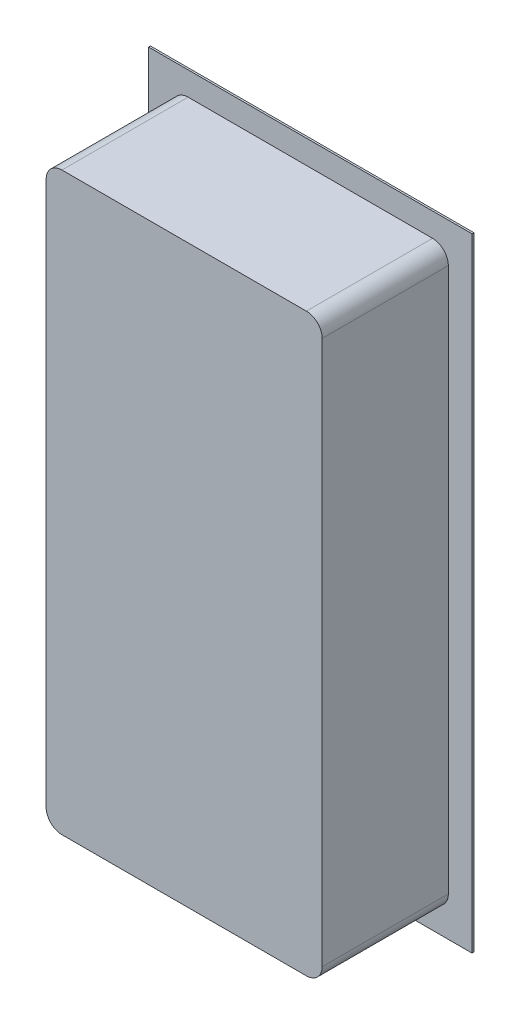
ISO-10303-21;
HEADER;
FILE_DESCRIPTION(('STEP AP214'),'2;1');
FILE_NAME('part.step','',(''),(''),'','','');
FILE_SCHEMA(('AUTOMOTIVE_DESIGN { 1 0 10303 214 1 1 1 1 }'));
ENDSEC;
DATA;
#1=APPLICATION_CONTEXT('core data for automotive mechanical design processes');
#2=APPLICATION_PROTOCOL_DEFINITION('international standard','automotive_design',2000,#1);
#3=PRODUCT_CONTEXT('',#1,'mechanical');
#4=PRODUCT('Part','Part','',(#3));
#5=PRODUCT_RELATED_PRODUCT_CATEGORY('part','',(#4));
#6=PRODUCT_DEFINITION_FORMATION('','',#4);
#7=PRODUCT_DEFINITION_CONTEXT('part definition',#1,'design');
#8=PRODUCT_DEFINITION('design','',#6,#7);
#9=PRODUCT_DEFINITION_SHAPE('','',#8);
#10=(LENGTH_UNIT() NAMED_UNIT(*) SI_UNIT(.MILLI.,.METRE.));
#11=(NAMED_UNIT(*) PLANE_ANGLE_UNIT() SI_UNIT($,.RADIAN.));
#12=(NAMED_UNIT(*) SI_UNIT($,.STERADIAN.) SOLID_ANGLE_UNIT());
#13=UNCERTAINTY_MEASURE_WITH_UNIT(LENGTH_MEASURE(1.E-05),#10,'distance_accuracy_value','');
#14=(GEOMETRIC_REPRESENTATION_CONTEXT(3) GLOBAL_UNCERTAINTY_ASSIGNED_CONTEXT((#13)) GLOBAL_UNIT_ASSIGNED_CONTEXT((#10,
#11,#12)) REPRESENTATION_CONTEXT('',''));
#15=CARTESIAN_POINT('',(0.,0.,0.));
#16=DIRECTION('',(0.,0.,1.));
#17=DIRECTION('',(1.,0.,0.));
#18=AXIS2_PLACEMENT_3D('',#15,#16,#17);
#19=CARTESIAN_POINT('',(-111.125,-231.775,101.6));
#20=DIRECTION('',(1.,0.,0.));
#21=DIRECTION('',(0.,0.,-1.));
#22=AXIS2_PLACEMENT_3D('',#19,#20,#21);
#23=PLANE('',#22);
#24=DIRECTION('',(0.,-1.,0.));
#25=VECTOR('',#24,1.);
#26=CARTESIAN_POINT('',(-111.125,-231.775,0.));
#27=LINE('',#26,#25);
#28=CARTESIAN_POINT('',(-111.125,219.075,0.));
#29=VERTEX_POINT('',#28);
#30=CARTESIAN_POINT('',(-111.125,-219.075,0.));
#31=VERTEX_POINT('',#30);
#32=EDGE_CURVE('E155',#29,#31,#27,.T.);
#33=ORIENTED_EDGE('',*,*,#32,.T.);
#34=DIRECTION('',(0.,0.,-1.));
#35=VECTOR('',#34,1.);
#36=CARTESIAN_POINT('',(-111.125,-219.075,101.6));
#37=LINE('',#36,#35);
#38=CARTESIAN_POINT('',(-111.125,-219.075,101.6));
#39=VERTEX_POINT('',#38);
#40=EDGE_CURVE('E203',#31,#39,#37,.F.);
#41=ORIENTED_EDGE('',*,*,#40,.T.);
#42=DIRECTION('',(0.,-1.,0.));
#43=VECTOR('',#42,1.);
#44=CARTESIAN_POINT('',(-111.125,-231.775,101.6));
#45=LINE('',#44,#43);
#46=CARTESIAN_POINT('',(-111.125,219.075,101.6));
#47=VERTEX_POINT('',#46);
#48=EDGE_CURVE('E166',#47,#39,#45,.T.);
#49=ORIENTED_EDGE('',*,*,#48,.F.);
#50=DIRECTION('',(0.,0.,-1.));
#51=VECTOR('',#50,1.);
#52=CARTESIAN_POINT('',(-111.125,219.075,101.6));
#53=LINE('',#52,#51);
#54=EDGE_CURVE('E199',#47,#29,#53,.T.);
#55=ORIENTED_EDGE('',*,*,#54,.T.);
#56=EDGE_LOOP('',(#33,#41,#49,#55));
#57=FACE_BOUND('',#56,.T.);
#58=ADVANCED_FACE('F38',(#57),#23,.F.);
#59=CARTESIAN_POINT('',(111.125,-231.775,101.6));
#60=DIRECTION('',(0.,1.,0.));
#61=DIRECTION('',(0.,0.,1.));
#62=AXIS2_PLACEMENT_3D('',#59,#60,#61);
#63=PLANE('',#62);
#64=DIRECTION('',(1.,0.,0.));
#65=VECTOR('',#64,1.);
#66=CARTESIAN_POINT('',(111.125,-231.775,101.6));
#67=LINE('',#66,#65);
#68=CARTESIAN_POINT('',(-98.4249999999999,-231.775,101.6));
#69=VERTEX_POINT('',#68);
#70=CARTESIAN_POINT('',(98.4250000000001,-231.775,101.6));
#71=VERTEX_POINT('',#70);
#72=EDGE_CURVE('E170',#69,#71,#67,.T.);
#73=ORIENTED_EDGE('',*,*,#72,.F.);
#74=DIRECTION('',(0.,0.,-1.));
#75=VECTOR('',#74,1.);
#76=CARTESIAN_POINT('',(-98.4249999999999,-231.775,101.6));
#77=LINE('',#76,#75);
#78=CARTESIAN_POINT('',(-98.4249999999999,-231.775,0.));
#79=VERTEX_POINT('',#78);
#80=EDGE_CURVE('E195',#69,#79,#77,.T.);
#81=ORIENTED_EDGE('',*,*,#80,.T.);
#82=DIRECTION('',(1.,0.,0.));
#83=VECTOR('',#82,1.);
#84=CARTESIAN_POINT('',(111.125,-231.775,0.));
#85=LINE('',#84,#83);
#86=CARTESIAN_POINT('',(98.4250000000001,-231.775,0.));
#87=VERTEX_POINT('',#86);
#88=EDGE_CURVE('E160',#79,#87,#85,.T.);
#89=ORIENTED_EDGE('',*,*,#88,.T.);
#90=DIRECTION('',(0.,0.,-1.));
#91=VECTOR('',#90,1.);
#92=CARTESIAN_POINT('',(98.4250000000001,-231.775,101.6));
#93=LINE('',#92,#91);
#94=EDGE_CURVE('E182',#87,#71,#93,.F.);
#95=ORIENTED_EDGE('',*,*,#94,.T.);
#96=EDGE_LOOP('',(#73,#81,#89,#95));
#97=FACE_BOUND('',#96,.T.);
#98=ADVANCED_FACE('F246',(#97),#63,.F.);
#99=CARTESIAN_POINT('',(111.125,-231.775,101.6));
#100=DIRECTION('',(-1.,0.,0.));
#101=DIRECTION('',(0.,0.,1.));
#102=AXIS2_PLACEMENT_3D('',#99,#100,#101);
#103=PLANE('',#102);
#104=DIRECTION('',(0.,1.,0.));
#105=VECTOR('',#104,1.);
#106=CARTESIAN_POINT('',(111.125,-231.775,101.6));
#107=LINE('',#106,#105);
#108=CARTESIAN_POINT('',(111.125,-219.075,101.6));
#109=VERTEX_POINT('',#108);
#110=CARTESIAN_POINT('',(111.125,219.075,101.6));
#111=VERTEX_POINT('',#110);
#112=EDGE_CURVE('E175',#109,#111,#107,.T.);
#113=ORIENTED_EDGE('',*,*,#112,.F.);
#114=DIRECTION('',(0.,0.,-1.));
#115=VECTOR('',#114,1.);
#116=CARTESIAN_POINT('',(111.125,-219.075,101.6));
#117=LINE('',#116,#115);
#118=CARTESIAN_POINT('',(111.125,-219.075,0.));
#119=VERTEX_POINT('',#118);
#120=EDGE_CURVE('E221',#109,#119,#117,.T.);
#121=ORIENTED_EDGE('',*,*,#120,.T.);
#122=DIRECTION('',(0.,1.,0.));
#123=VECTOR('',#122,1.);
#124=CARTESIAN_POINT('',(111.125,-231.775,0.));
#125=LINE('',#124,#123);
#126=CARTESIAN_POINT('',(111.125,219.075,0.));
#127=VERTEX_POINT('',#126);
#128=EDGE_CURVE('E187',#119,#127,#125,.T.);
#129=ORIENTED_EDGE('',*,*,#128,.T.);
#130=DIRECTION('',(0.,0.,-1.));
#131=VECTOR('',#130,1.);
#132=CARTESIAN_POINT('',(111.125,219.075,101.6));
#133=LINE('',#132,#131);
#134=EDGE_CURVE('E218',#127,#111,#133,.F.);
#135=ORIENTED_EDGE('',*,*,#134,.T.);
#136=EDGE_LOOP('',(#113,#121,#129,#135));
#137=FACE_BOUND('',#136,.T.);
#138=ADVANCED_FACE('F255',(#137),#103,.F.);
#139=CARTESIAN_POINT('',(111.125,231.775,101.6));
#140=DIRECTION('',(0.,-1.,0.));
#141=DIRECTION('',(1.,0.,0.));
#142=AXIS2_PLACEMENT_3D('',#139,#140,#141);
#143=PLANE('',#142);
#144=DIRECTION('',(-1.,0.,0.));
#145=VECTOR('',#144,1.);
#146=CARTESIAN_POINT('',(111.125,231.775,0.));
#147=LINE('',#146,#145);
#148=CARTESIAN_POINT('',(98.4250000000001,231.775,0.));
#149=VERTEX_POINT('',#148);
#150=CARTESIAN_POINT('',(-98.4249999999999,231.775,0.));
#151=VERTEX_POINT('',#150);
#152=EDGE_CURVE('E171',#149,#151,#147,.T.);
#153=ORIENTED_EDGE('',*,*,#152,.T.);
#154=DIRECTION('',(0.,0.,-1.));
#155=VECTOR('',#154,1.);
#156=CARTESIAN_POINT('',(-98.4249999999999,231.775,101.6));
#157=LINE('',#156,#155);
#158=CARTESIAN_POINT('',(-98.4249999999999,231.775,101.6));
#159=VERTEX_POINT('',#158);
#160=EDGE_CURVE('E228',#151,#159,#157,.F.);
#161=ORIENTED_EDGE('',*,*,#160,.T.);
#162=DIRECTION('',(-1.,0.,0.));
#163=VECTOR('',#162,1.);
#164=CARTESIAN_POINT('',(111.125,231.775,101.6));
#165=LINE('',#164,#163);
#166=CARTESIAN_POINT('',(98.4250000000001,231.775,101.6));
#167=VERTEX_POINT('',#166);
#168=EDGE_CURVE('E179',#167,#159,#165,.T.);
#169=ORIENTED_EDGE('',*,*,#168,.F.);
#170=DIRECTION('',(0.,0.,-1.));
#171=VECTOR('',#170,1.);
#172=CARTESIAN_POINT('',(98.4250000000001,231.775,101.6));
#173=LINE('',#172,#171);
#174=EDGE_CURVE('E225',#167,#149,#173,.T.);
#175=ORIENTED_EDGE('',*,*,#174,.T.);
#176=EDGE_LOOP('',(#153,#161,#169,#175));
#177=FACE_BOUND('',#176,.T.);
#178=ADVANCED_FACE('F259',(#177),#143,.F.);
#179=CARTESIAN_POINT('',(0.,0.,101.6));
#180=DIRECTION('',(0.,0.,1.));
#181=DIRECTION('',(1.,0.,0.));
#182=AXIS2_PLACEMENT_3D('',#179,#180,#181);
#183=PLANE('',#182);
#184=ORIENTED_EDGE('',*,*,#48,.T.);
#185=CARTESIAN_POINT('',(-98.4249999999999,-219.075,101.6));
#186=DIRECTION('',(0.,0.,1.));
#187=DIRECTION('',(1.,0.,0.));
#188=AXIS2_PLACEMENT_3D('',#185,#186,#187);
#189=CIRCLE('',#188,12.7);
#190=EDGE_CURVE('E215',#39,#69,#189,.T.);
#191=ORIENTED_EDGE('',*,*,#190,.T.);
#192=ORIENTED_EDGE('',*,*,#72,.T.);
#193=CARTESIAN_POINT('',(98.4250000000001,-219.075,101.6));
#194=DIRECTION('',(0.,0.,1.));
#195=DIRECTION('',(1.,0.,0.));
#196=AXIS2_PLACEMENT_3D('',#193,#194,#195);
#197=CIRCLE('',#196,12.7);
#198=EDGE_CURVE('E212',#71,#109,#197,.T.);
#199=ORIENTED_EDGE('',*,*,#198,.T.);
#200=ORIENTED_EDGE('',*,*,#112,.T.);
#201=CARTESIAN_POINT('',(98.4250000000001,219.075,101.6));
#202=DIRECTION('',(0.,0.,1.));
#203=DIRECTION('',(1.,0.,0.));
#204=AXIS2_PLACEMENT_3D('',#201,#202,#203);
#205=CIRCLE('',#204,12.7);
#206=EDGE_CURVE('E206',#111,#167,#205,.T.);
#207=ORIENTED_EDGE('',*,*,#206,.T.);
#208=ORIENTED_EDGE('',*,*,#168,.T.);
#209=CARTESIAN_POINT('',(-98.4249999999999,219.075,101.6));
#210=DIRECTION('',(0.,0.,1.));
#211=DIRECTION('',(1.,0.,0.));
#212=AXIS2_PLACEMENT_3D('',#209,#210,#211);
#213=CIRCLE('',#212,12.7);
#214=EDGE_CURVE('E209',#159,#47,#213,.T.);
#215=ORIENTED_EDGE('',*,*,#214,.T.);
#216=EDGE_LOOP('',(#184,#191,#192,#199,#200,#207,#208,#215));
#217=FACE_BOUND('',#216,.T.);
#218=ADVANCED_FACE('F252',(#217),#183,.T.);
#219=CARTESIAN_POINT('',(130.175,-250.825,-1.5));
#220=DIRECTION('',(-1.,0.,0.));
#221=DIRECTION('',(0.,0.,1.));
#222=AXIS2_PLACEMENT_3D('',#219,#220,#221);
#223=PLANE('',#222);
#224=DIRECTION('',(0.,-1.,0.));
#225=VECTOR('',#224,1.);
#226=CARTESIAN_POINT('',(130.175,-250.825,0.));
#227=LINE('',#226,#225);
#228=CARTESIAN_POINT('',(130.175,250.825,0.));
#229=VERTEX_POINT('',#228);
#230=CARTESIAN_POINT('',(130.175,-250.825,0.));
#231=VERTEX_POINT('',#230);
#232=EDGE_CURVE('E153',#229,#231,#227,.T.);
#233=ORIENTED_EDGE('',*,*,#232,.T.);
#234=DIRECTION('',(0.,0.,1.));
#235=VECTOR('',#234,1.);
#236=CARTESIAN_POINT('',(130.175,-250.825,-1.5));
#237=LINE('',#236,#235);
#238=CARTESIAN_POINT('',(130.175,-250.825,-1.5));
#239=VERTEX_POINT('',#238);
#240=EDGE_CURVE('E131',#239,#231,#237,.T.);
#241=ORIENTED_EDGE('',*,*,#240,.F.);
#242=DIRECTION('',(0.,-1.,0.));
#243=VECTOR('',#242,1.);
#244=CARTESIAN_POINT('',(130.175,-250.825,-1.5));
#245=LINE('',#244,#243);
#246=CARTESIAN_POINT('',(130.175,250.825,-1.5));
#247=VERTEX_POINT('',#246);
#248=EDGE_CURVE('E139',#247,#239,#245,.T.);
#249=ORIENTED_EDGE('',*,*,#248,.F.);
#250=DIRECTION('',(0.,0.,1.));
#251=VECTOR('',#250,1.);
#252=CARTESIAN_POINT('',(130.175,250.825,-1.5));
#253=LINE('',#252,#251);
#254=EDGE_CURVE('E394',#247,#229,#253,.T.);
#255=ORIENTED_EDGE('',*,*,#254,.T.);
#256=EDGE_LOOP('',(#233,#241,#249,#255));
#257=FACE_BOUND('',#256,.T.);
#258=ADVANCED_FACE('F151',(#257),#223,.F.);
#259=CARTESIAN_POINT('',(-130.175,-250.825,-1.5));
#260=DIRECTION('',(0.,1.,0.));
#261=DIRECTION('',(-1.,0.,0.));
#262=AXIS2_PLACEMENT_3D('',#259,#260,#261);
#263=PLANE('',#262);
#264=DIRECTION('',(-1.,0.,0.));
#265=VECTOR('',#264,1.);
#266=CARTESIAN_POINT('',(-130.175,-250.825,0.));
#267=LINE('',#266,#265);
#268=CARTESIAN_POINT('',(-130.175,-250.825,0.));
#269=VERTEX_POINT('',#268);
#270=EDGE_CURVE('E402',#231,#269,#267,.T.);
#271=ORIENTED_EDGE('',*,*,#270,.T.);
#272=DIRECTION('',(0.,0.,1.));
#273=VECTOR('',#272,1.);
#274=CARTESIAN_POINT('',(-130.175,-250.825,-1.5));
#275=LINE('',#274,#273);
#276=CARTESIAN_POINT('',(-130.175,-250.825,-1.5));
#277=VERTEX_POINT('',#276);
#278=EDGE_CURVE('E134',#277,#269,#275,.T.);
#279=ORIENTED_EDGE('',*,*,#278,.F.);
#280=DIRECTION('',(-1.,0.,0.));
#281=VECTOR('',#280,1.);
#282=CARTESIAN_POINT('',(-130.175,-250.825,-1.5));
#283=LINE('',#282,#281);
#284=EDGE_CURVE('E127',#239,#277,#283,.T.);
#285=ORIENTED_EDGE('',*,*,#284,.F.);
#286=ORIENTED_EDGE('',*,*,#240,.T.);
#287=EDGE_LOOP('',(#271,#279,#285,#286));
#288=FACE_BOUND('',#287,.T.);
#289=ADVANCED_FACE('F129',(#288),#263,.F.);
#290=CARTESIAN_POINT('',(-130.175,-250.825,-1.5));
#291=DIRECTION('',(1.,0.,0.));
#292=DIRECTION('',(0.,0.,-1.));
#293=AXIS2_PLACEMENT_3D('',#290,#291,#292);
#294=PLANE('',#293);
#295=DIRECTION('',(0.,1.,0.));
#296=VECTOR('',#295,1.);
#297=CARTESIAN_POINT('',(-130.175,-250.825,0.));
#298=LINE('',#297,#296);
#299=CARTESIAN_POINT('',(-130.175,250.825,0.));
#300=VERTEX_POINT('',#299);
#301=EDGE_CURVE('E398',#269,#300,#298,.T.);
#302=ORIENTED_EDGE('',*,*,#301,.T.);
#303=DIRECTION('',(0.,0.,1.));
#304=VECTOR('',#303,1.);
#305=CARTESIAN_POINT('',(-130.175,250.825,-1.5));
#306=LINE('',#305,#304);
#307=CARTESIAN_POINT('',(-130.175,250.825,-1.5));
#308=VERTEX_POINT('',#307);
#309=EDGE_CURVE('E162',#308,#300,#306,.T.);
#310=ORIENTED_EDGE('',*,*,#309,.F.);
#311=DIRECTION('',(0.,1.,0.));
#312=VECTOR('',#311,1.);
#313=CARTESIAN_POINT('',(-130.175,-250.825,-1.5));
#314=LINE('',#313,#312);
#315=EDGE_CURVE('E138',#277,#308,#314,.T.);
#316=ORIENTED_EDGE('',*,*,#315,.F.);
#317=ORIENTED_EDGE('',*,*,#278,.T.);
#318=EDGE_LOOP('',(#302,#310,#316,#317));
#319=FACE_BOUND('',#318,.T.);
#320=ADVANCED_FACE('F297',(#319),#294,.F.);
#321=CARTESIAN_POINT('',(-130.175,250.825,-1.5));
#322=DIRECTION('',(0.,-1.,0.));
#323=DIRECTION('',(0.,0.,-1.));
#324=AXIS2_PLACEMENT_3D('',#321,#322,#323);
#325=PLANE('',#324);
#326=DIRECTION('',(1.,0.,0.));
#327=VECTOR('',#326,1.);
#328=CARTESIAN_POINT('',(-130.175,250.825,0.));
#329=LINE('',#328,#327);
#330=EDGE_CURVE('E149',#300,#229,#329,.T.);
#331=ORIENTED_EDGE('',*,*,#330,.T.);
#332=ORIENTED_EDGE('',*,*,#254,.F.);
#333=DIRECTION('',(1.,0.,0.));
#334=VECTOR('',#333,1.);
#335=CARTESIAN_POINT('',(-130.175,250.825,-1.5));
#336=LINE('',#335,#334);
#337=EDGE_CURVE('E144',#308,#247,#336,.T.);
#338=ORIENTED_EDGE('',*,*,#337,.F.);
#339=ORIENTED_EDGE('',*,*,#309,.T.);
#340=EDGE_LOOP('',(#331,#332,#338,#339));
#341=FACE_BOUND('',#340,.T.);
#342=ADVANCED_FACE('F300',(#341),#325,.F.);
#343=CARTESIAN_POINT('',(0.,0.,-1.5));
#344=DIRECTION('',(0.,0.,-1.));
#345=DIRECTION('',(-1.,0.,0.));
#346=AXIS2_PLACEMENT_3D('',#343,#344,#345);
#347=PLANE('',#346);
#348=ORIENTED_EDGE('',*,*,#248,.T.);
#349=ORIENTED_EDGE('',*,*,#284,.T.);
#350=ORIENTED_EDGE('',*,*,#315,.T.);
#351=ORIENTED_EDGE('',*,*,#337,.T.);
#352=EDGE_LOOP('',(#348,#349,#350,#351));
#353=FACE_BOUND('',#352,.T.);
#354=ADVANCED_FACE('F142',(#353),#347,.T.);
#355=CARTESIAN_POINT('',(0.,0.,0.));
#356=DIRECTION('',(0.,0.,-1.));
#357=DIRECTION('',(-1.,0.,0.));
#358=AXIS2_PLACEMENT_3D('',#355,#356,#357);
#359=PLANE('',#358);
#360=ORIENTED_EDGE('',*,*,#32,.F.);
#361=CARTESIAN_POINT('',(-98.4249999999999,219.075,0.));
#362=DIRECTION('',(0.,0.,-1.));
#363=DIRECTION('',(-1.,0.,0.));
#364=AXIS2_PLACEMENT_3D('',#361,#362,#363);
#365=CIRCLE('',#364,12.7);
#366=EDGE_CURVE('E47',#29,#151,#365,.T.);
#367=ORIENTED_EDGE('',*,*,#366,.T.);
#368=ORIENTED_EDGE('',*,*,#152,.F.);
#369=CARTESIAN_POINT('',(98.4250000000001,219.075,0.));
#370=DIRECTION('',(0.,0.,-1.));
#371=DIRECTION('',(-1.,0.,0.));
#372=AXIS2_PLACEMENT_3D('',#369,#370,#371);
#373=CIRCLE('',#372,12.7);
#374=EDGE_CURVE('E11',#149,#127,#373,.T.);
#375=ORIENTED_EDGE('',*,*,#374,.T.);
#376=ORIENTED_EDGE('',*,*,#128,.F.);
#377=CARTESIAN_POINT('',(98.4250000000001,-219.075,0.));
#378=DIRECTION('',(0.,0.,-1.));
#379=DIRECTION('',(-1.,0.,0.));
#380=AXIS2_PLACEMENT_3D('',#377,#378,#379);
#381=CIRCLE('',#380,12.7);
#382=EDGE_CURVE('E234',#119,#87,#381,.T.);
#383=ORIENTED_EDGE('',*,*,#382,.T.);
#384=ORIENTED_EDGE('',*,*,#88,.F.);
#385=CARTESIAN_POINT('',(-98.4249999999999,-219.075,0.));
#386=DIRECTION('',(0.,0.,-1.));
#387=DIRECTION('',(-1.,0.,0.));
#388=AXIS2_PLACEMENT_3D('',#385,#386,#387);
#389=CIRCLE('',#388,12.7);
#390=EDGE_CURVE('E231',#79,#31,#389,.T.);
#391=ORIENTED_EDGE('',*,*,#390,.T.);
#392=EDGE_LOOP('',(#360,#367,#368,#375,#376,#383,#384,#391));
#393=FACE_BOUND('',#392,.T.);
#394=ORIENTED_EDGE('',*,*,#232,.F.);
#395=ORIENTED_EDGE('',*,*,#330,.F.);
#396=ORIENTED_EDGE('',*,*,#301,.F.);
#397=ORIENTED_EDGE('',*,*,#270,.F.);
#398=EDGE_LOOP('',(#394,#395,#396,#397));
#399=FACE_BOUND('',#398,.T.);
#400=ADVANCED_FACE('F239',(#393,#399),#359,.F.);
#401=CARTESIAN_POINT('',(-98.4249999999999,-219.075,101.6));
#402=DIRECTION('',(0.,0.,-1.));
#403=DIRECTION('',(-1.,0.,0.));
#404=AXIS2_PLACEMENT_3D('',#401,#402,#403);
#405=CYLINDRICAL_SURFACE('',#404,12.7);
#406=ORIENTED_EDGE('',*,*,#190,.F.);
#407=ORIENTED_EDGE('',*,*,#40,.F.);
#408=ORIENTED_EDGE('',*,*,#390,.F.);
#409=ORIENTED_EDGE('',*,*,#80,.F.);
#410=EDGE_LOOP('',(#406,#407,#408,#409));
#411=FACE_BOUND('',#410,.T.);
#412=ADVANCED_FACE('F269',(#411),#405,.T.);
#413=CARTESIAN_POINT('',(98.4250000000001,-219.075,101.6));
#414=DIRECTION('',(0.,0.,-1.));
#415=DIRECTION('',(-1.,0.,0.));
#416=AXIS2_PLACEMENT_3D('',#413,#414,#415);
#417=CYLINDRICAL_SURFACE('',#416,12.7);
#418=ORIENTED_EDGE('',*,*,#198,.F.);
#419=ORIENTED_EDGE('',*,*,#94,.F.);
#420=ORIENTED_EDGE('',*,*,#382,.F.);
#421=ORIENTED_EDGE('',*,*,#120,.F.);
#422=EDGE_LOOP('',(#418,#419,#420,#421));
#423=FACE_BOUND('',#422,.T.);
#424=ADVANCED_FACE('F249',(#423),#417,.T.);
#425=CARTESIAN_POINT('',(-98.4249999999999,219.075,101.6));
#426=DIRECTION('',(0.,0.,-1.));
#427=DIRECTION('',(-1.,0.,0.));
#428=AXIS2_PLACEMENT_3D('',#425,#426,#427);
#429=CYLINDRICAL_SURFACE('',#428,12.7);
#430=ORIENTED_EDGE('',*,*,#214,.F.);
#431=ORIENTED_EDGE('',*,*,#160,.F.);
#432=ORIENTED_EDGE('',*,*,#366,.F.);
#433=ORIENTED_EDGE('',*,*,#54,.F.);
#434=EDGE_LOOP('',(#430,#431,#432,#433));
#435=FACE_BOUND('',#434,.T.);
#436=ADVANCED_FACE('F262',(#435),#429,.T.);
#437=CARTESIAN_POINT('',(98.4250000000001,219.075,101.6));
#438=DIRECTION('',(0.,0.,-1.));
#439=DIRECTION('',(-1.,0.,0.));
#440=AXIS2_PLACEMENT_3D('',#437,#438,#439);
#441=CYLINDRICAL_SURFACE('',#440,12.7);
#442=ORIENTED_EDGE('',*,*,#206,.F.);
#443=ORIENTED_EDGE('',*,*,#134,.F.);
#444=ORIENTED_EDGE('',*,*,#374,.F.);
#445=ORIENTED_EDGE('',*,*,#174,.F.);
#446=EDGE_LOOP('',(#442,#443,#444,#445));
#447=FACE_BOUND('',#446,.T.);
#448=ADVANCED_FACE('F40',(#447),#441,.T.);
#449=CLOSED_SHELL('',(#58,#98,#138,#178,#218,#258,#289,#320,#342,#354,#400,#412,#424,#436,#448));
#450=MANIFOLD_SOLID_BREP('B2',#449);
#451=ADVANCED_BREP_SHAPE_REPRESENTATION('',(#18,#450),#14);
#452=SHAPE_DEFINITION_REPRESENTATION(#9,#451);
ENDSEC;
END-ISO-10303-21;
